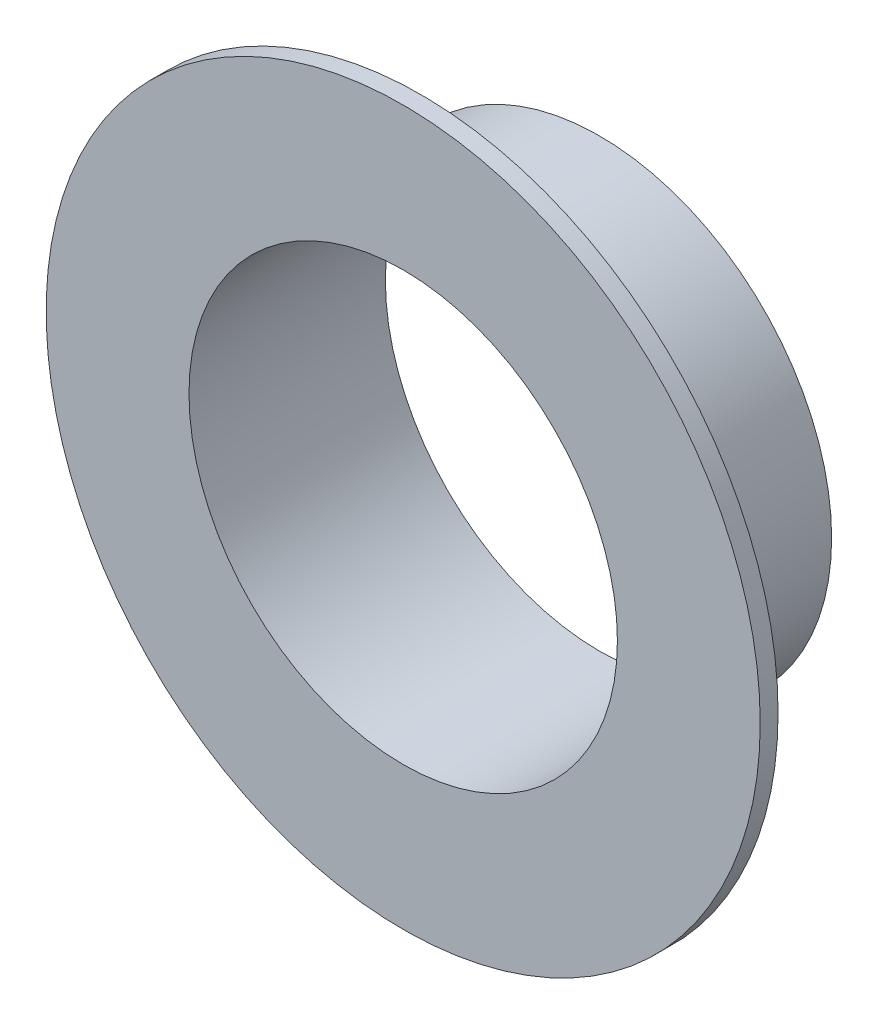
ISO-10303-21;
HEADER;
FILE_DESCRIPTION(('STEP AP214'),'2;1');
FILE_NAME('part.step','',(''),(''),'','','');
FILE_SCHEMA(('AUTOMOTIVE_DESIGN { 1 0 10303 214 1 1 1 1 }'));
ENDSEC;
DATA;
#1=APPLICATION_CONTEXT('core data for automotive mechanical design processes');
#2=APPLICATION_PROTOCOL_DEFINITION('international standard','automotive_design',2000,#1);
#3=PRODUCT_CONTEXT('',#1,'mechanical');
#4=PRODUCT('Part','Part','',(#3));
#5=PRODUCT_RELATED_PRODUCT_CATEGORY('part','',(#4));
#6=PRODUCT_DEFINITION_FORMATION('','',#4);
#7=PRODUCT_DEFINITION_CONTEXT('part definition',#1,'design');
#8=PRODUCT_DEFINITION('design','',#6,#7);
#9=PRODUCT_DEFINITION_SHAPE('','',#8);
#10=(LENGTH_UNIT() NAMED_UNIT(*) SI_UNIT(.MILLI.,.METRE.));
#11=(NAMED_UNIT(*) PLANE_ANGLE_UNIT() SI_UNIT($,.RADIAN.));
#12=(NAMED_UNIT(*) SI_UNIT($,.STERADIAN.) SOLID_ANGLE_UNIT());
#13=UNCERTAINTY_MEASURE_WITH_UNIT(LENGTH_MEASURE(1.E-05),#10,'distance_accuracy_value','');
#14=(GEOMETRIC_REPRESENTATION_CONTEXT(3) GLOBAL_UNCERTAINTY_ASSIGNED_CONTEXT((#13)) GLOBAL_UNIT_ASSIGNED_CONTEXT((#10,
#11,#12)) REPRESENTATION_CONTEXT('',''));
#15=CARTESIAN_POINT('',(0.,0.,0.));
#16=DIRECTION('',(0.,0.,1.));
#17=DIRECTION('',(1.,0.,0.));
#18=AXIS2_PLACEMENT_3D('',#15,#16,#17);
#19=CARTESIAN_POINT('',(0.,0.,0.));
#20=DIRECTION('',(0.,0.,1.));
#21=DIRECTION('',(1.,0.,0.));
#22=AXIS2_PLACEMENT_3D('',#19,#20,#21);
#23=PLANE('',#22);
#24=CARTESIAN_POINT('',(0.,0.,0.));
#25=DIRECTION('',(0.,0.,1.));
#26=DIRECTION('',(1.,0.,0.));
#27=AXIS2_PLACEMENT_3D('',#24,#25,#26);
#28=CIRCLE('',#27,6.5);
#29=CARTESIAN_POINT('',(6.5,0.,0.));
#30=VERTEX_POINT('',#29);
#31=EDGE_CURVE('E37',#30,#30,#28,.T.);
#32=ORIENTED_EDGE('',*,*,#31,.F.);
#33=EDGE_LOOP('',(#32));
#34=FACE_BOUND('',#33,.T.);
#35=CARTESIAN_POINT('',(0.,0.,0.));
#36=DIRECTION('',(0.,0.,1.));
#37=DIRECTION('',(1.,0.,0.));
#38=AXIS2_PLACEMENT_3D('',#35,#36,#37);
#39=CIRCLE('',#38,6.);
#40=CARTESIAN_POINT('',(6.,0.,0.));
#41=VERTEX_POINT('',#40);
#42=EDGE_CURVE('E41',#41,#41,#39,.T.);
#43=ORIENTED_EDGE('',*,*,#42,.T.);
#44=EDGE_LOOP('',(#43));
#45=FACE_BOUND('',#44,.T.);
#46=ADVANCED_FACE('F30',(#34,#45),#23,.F.);
#47=CARTESIAN_POINT('',(0.,0.,4.99999999999998));
#48=DIRECTION('',(0.,0.,-1.));
#49=DIRECTION('',(-1.,0.,0.));
#50=AXIS2_PLACEMENT_3D('',#47,#48,#49);
#51=CYLINDRICAL_SURFACE('',#50,6.5);
#52=CARTESIAN_POINT('',(0.,0.,4.99999999999998));
#53=DIRECTION('',(0.,0.,1.));
#54=DIRECTION('',(1.,0.,0.));
#55=AXIS2_PLACEMENT_3D('',#52,#53,#54);
#56=CIRCLE('',#55,6.5);
#57=CARTESIAN_POINT('',(6.5,0.,4.99999999999998));
#58=VERTEX_POINT('',#57);
#59=EDGE_CURVE('E10',#58,#58,#56,.T.);
#60=ORIENTED_EDGE('',*,*,#59,.F.);
#61=EDGE_LOOP('',(#60));
#62=FACE_BOUND('',#61,.T.);
#63=ORIENTED_EDGE('',*,*,#31,.T.);
#64=EDGE_LOOP('',(#63));
#65=FACE_BOUND('',#64,.T.);
#66=ADVANCED_FACE('F32',(#62,#65),#51,.T.);
#67=CARTESIAN_POINT('',(0.,0.,4.99999999999998));
#68=DIRECTION('',(0.,0.,-1.));
#69=DIRECTION('',(-1.,0.,0.));
#70=AXIS2_PLACEMENT_3D('',#67,#68,#69);
#71=CYLINDRICAL_SURFACE('',#70,6.);
#72=ORIENTED_EDGE('',*,*,#42,.F.);
#73=EDGE_LOOP('',(#72));
#74=FACE_BOUND('',#73,.T.);
#75=CARTESIAN_POINT('',(0.,0.,5.49999999999998));
#76=DIRECTION('',(0.,0.,1.));
#77=DIRECTION('',(1.,0.,0.));
#78=AXIS2_PLACEMENT_3D('',#75,#76,#77);
#79=CIRCLE('',#78,6.);
#80=CARTESIAN_POINT('',(6.,0.,5.49999999999998));
#81=VERTEX_POINT('',#80);
#82=EDGE_CURVE('E53',#81,#81,#79,.T.);
#83=ORIENTED_EDGE('',*,*,#82,.T.);
#84=EDGE_LOOP('',(#83));
#85=FACE_BOUND('',#84,.T.);
#86=ADVANCED_FACE('F57',(#74,#85),#71,.F.);
#87=CARTESIAN_POINT('',(0.,0.,4.99999999999998));
#88=DIRECTION('',(0.,0.,1.));
#89=DIRECTION('',(1.,0.,0.));
#90=AXIS2_PLACEMENT_3D('',#87,#88,#89);
#91=PLANE('',#90);
#92=CARTESIAN_POINT('',(0.,0.,4.99999999999998));
#93=DIRECTION('',(0.,0.,1.));
#94=DIRECTION('',(1.,0.,0.));
#95=AXIS2_PLACEMENT_3D('',#92,#93,#94);
#96=CIRCLE('',#95,10.);
#97=CARTESIAN_POINT('',(10.,0.,4.99999999999998));
#98=VERTEX_POINT('',#97);
#99=EDGE_CURVE('E50',#98,#98,#96,.T.);
#100=ORIENTED_EDGE('',*,*,#99,.F.);
#101=EDGE_LOOP('',(#100));
#102=FACE_BOUND('',#101,.T.);
#103=ORIENTED_EDGE('',*,*,#59,.T.);
#104=EDGE_LOOP('',(#103));
#105=FACE_BOUND('',#104,.T.);
#106=ADVANCED_FACE('F62',(#102,#105),#91,.F.);
#107=CARTESIAN_POINT('',(0.,0.,5.49999999999998));
#108=DIRECTION('',(0.,0.,1.));
#109=DIRECTION('',(1.,0.,0.));
#110=AXIS2_PLACEMENT_3D('',#107,#108,#109);
#111=PLANE('',#110);
#112=CARTESIAN_POINT('',(0.,0.,5.49999999999998));
#113=DIRECTION('',(0.,0.,1.));
#114=DIRECTION('',(1.,0.,0.));
#115=AXIS2_PLACEMENT_3D('',#112,#113,#114);
#116=CIRCLE('',#115,10.);
#117=CARTESIAN_POINT('',(10.,0.,5.49999999999998));
#118=VERTEX_POINT('',#117);
#119=EDGE_CURVE('E45',#118,#118,#116,.T.);
#120=ORIENTED_EDGE('',*,*,#119,.T.);
#121=EDGE_LOOP('',(#120));
#122=FACE_BOUND('',#121,.T.);
#123=ORIENTED_EDGE('',*,*,#82,.F.);
#124=EDGE_LOOP('',(#123));
#125=FACE_BOUND('',#124,.T.);
#126=ADVANCED_FACE('F59',(#122,#125),#111,.T.);
#127=CARTESIAN_POINT('',(0.,0.,5.49999999999998));
#128=DIRECTION('',(0.,0.,-1.));
#129=DIRECTION('',(-1.,0.,0.));
#130=AXIS2_PLACEMENT_3D('',#127,#128,#129);
#131=CYLINDRICAL_SURFACE('',#130,10.);
#132=ORIENTED_EDGE('',*,*,#119,.F.);
#133=EDGE_LOOP('',(#132));
#134=FACE_BOUND('',#133,.T.);
#135=ORIENTED_EDGE('',*,*,#99,.T.);
#136=EDGE_LOOP('',(#135));
#137=FACE_BOUND('',#136,.T.);
#138=ADVANCED_FACE('F61',(#134,#137),#131,.T.);
#139=CLOSED_SHELL('',(#46,#66,#86,#106,#126,#138));
#140=MANIFOLD_SOLID_BREP('B2',#139);
#141=ADVANCED_BREP_SHAPE_REPRESENTATION('',(#18,#140),#14);
#142=SHAPE_DEFINITION_REPRESENTATION(#9,#141);
ENDSEC;
END-ISO-10303-21;
